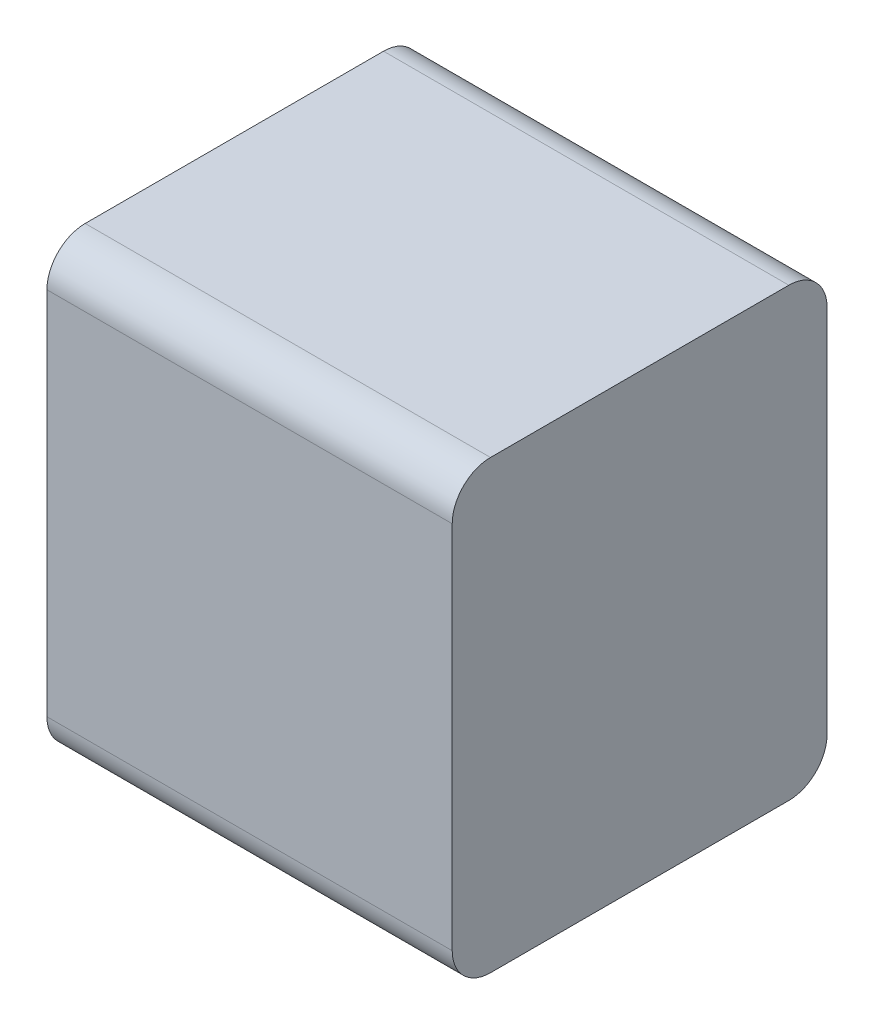
ISO-10303-21;
HEADER;
FILE_DESCRIPTION(('STEP AP214'),'2;1');
FILE_NAME('part.step','',(''),(''),'','','');
FILE_SCHEMA(('AUTOMOTIVE_DESIGN { 1 0 10303 214 1 1 1 1 }'));
ENDSEC;
DATA;
#1=APPLICATION_CONTEXT('core data for automotive mechanical design processes');
#2=APPLICATION_PROTOCOL_DEFINITION('international standard','automotive_design',2000,#1);
#3=PRODUCT_CONTEXT('',#1,'mechanical');
#4=PRODUCT('Part','Part','',(#3));
#5=PRODUCT_RELATED_PRODUCT_CATEGORY('part','',(#4));
#6=PRODUCT_DEFINITION_FORMATION('','',#4);
#7=PRODUCT_DEFINITION_CONTEXT('part definition',#1,'design');
#8=PRODUCT_DEFINITION('design','',#6,#7);
#9=PRODUCT_DEFINITION_SHAPE('','',#8);
#10=(LENGTH_UNIT() NAMED_UNIT(*) SI_UNIT(.MILLI.,.METRE.));
#11=(NAMED_UNIT(*) PLANE_ANGLE_UNIT() SI_UNIT($,.RADIAN.));
#12=(NAMED_UNIT(*) SI_UNIT($,.STERADIAN.) SOLID_ANGLE_UNIT());
#13=UNCERTAINTY_MEASURE_WITH_UNIT(LENGTH_MEASURE(1.E-05),#10,'distance_accuracy_value','');
#14=(GEOMETRIC_REPRESENTATION_CONTEXT(3) GLOBAL_UNCERTAINTY_ASSIGNED_CONTEXT((#13)) GLOBAL_UNIT_ASSIGNED_CONTEXT((#10,
#11,#12)) REPRESENTATION_CONTEXT('',''));
#15=CARTESIAN_POINT('',(0.,0.,0.));
#16=DIRECTION('',(0.,0.,1.));
#17=DIRECTION('',(1.,0.,0.));
#18=AXIS2_PLACEMENT_3D('',#15,#16,#17);
#19=CARTESIAN_POINT('',(-2.225,-2.45,0.042));
#20=DIRECTION('',(1.,0.,0.));
#21=DIRECTION('',(0.,0.,1.));
#22=AXIS2_PLACEMENT_3D('',#19,#20,#21);
#23=PLANE('',#22);
#24=CARTESIAN_POINT('',(-2.225,-2.03,3.738));
#25=DIRECTION('',(-1.,0.,0.));
#26=DIRECTION('',(0.,0.,1.));
#27=AXIS2_PLACEMENT_3D('',#24,#25,#26);
#28=CIRCLE('',#27,0.42);
#29=CARTESIAN_POINT('',(-2.225,-2.45,3.738));
#30=VERTEX_POINT('',#29);
#31=CARTESIAN_POINT('',(-2.225,-2.03,4.158));
#32=VERTEX_POINT('',#31);
#33=EDGE_CURVE('E11',#30,#32,#28,.T.);
#34=ORIENTED_EDGE('',*,*,#33,.T.);
#35=DIRECTION('',(0.,1.,0.));
#36=VECTOR('',#35,1.);
#37=CARTESIAN_POINT('',(-2.225,-2.45,4.158));
#38=LINE('',#37,#36);
#39=CARTESIAN_POINT('',(-2.225,2.03,4.158));
#40=VERTEX_POINT('',#39);
#41=EDGE_CURVE('E24',#32,#40,#38,.T.);
#42=ORIENTED_EDGE('',*,*,#41,.T.);
#43=CARTESIAN_POINT('',(-2.225,2.03,3.738));
#44=DIRECTION('',(1.,0.,0.));
#45=DIRECTION('',(0.,0.,1.));
#46=AXIS2_PLACEMENT_3D('',#43,#44,#45);
#47=CIRCLE('',#46,0.42);
#48=CARTESIAN_POINT('',(-2.225,2.45,3.738));
#49=VERTEX_POINT('',#48);
#50=EDGE_CURVE('E143',#49,#40,#47,.T.);
#51=ORIENTED_EDGE('',*,*,#50,.F.);
#52=DIRECTION('',(0.,0.,1.));
#53=VECTOR('',#52,1.);
#54=CARTESIAN_POINT('',(-2.225,2.45,0.042));
#55=LINE('',#54,#53);
#56=CARTESIAN_POINT('',(-2.225,2.45,0.462));
#57=VERTEX_POINT('',#56);
#58=EDGE_CURVE('E98',#57,#49,#55,.T.);
#59=ORIENTED_EDGE('',*,*,#58,.F.);
#60=CARTESIAN_POINT('',(-2.225,2.03,0.462));
#61=DIRECTION('',(-1.,0.,0.));
#62=DIRECTION('',(0.,0.,1.));
#63=AXIS2_PLACEMENT_3D('',#60,#61,#62);
#64=CIRCLE('',#63,0.42);
#65=CARTESIAN_POINT('',(-2.225,2.03,0.042));
#66=VERTEX_POINT('',#65);
#67=EDGE_CURVE('E139',#57,#66,#64,.T.);
#68=ORIENTED_EDGE('',*,*,#67,.T.);
#69=DIRECTION('',(0.,1.,0.));
#70=VECTOR('',#69,1.);
#71=CARTESIAN_POINT('',(-2.225,-2.45,0.042));
#72=LINE('',#71,#70);
#73=CARTESIAN_POINT('',(-2.225,-2.03,0.042));
#74=VERTEX_POINT('',#73);
#75=EDGE_CURVE('E137',#74,#66,#72,.T.);
#76=ORIENTED_EDGE('',*,*,#75,.F.);
#77=CARTESIAN_POINT('',(-2.225,-2.03,0.462));
#78=DIRECTION('',(1.,0.,0.));
#79=DIRECTION('',(0.,0.,1.));
#80=AXIS2_PLACEMENT_3D('',#77,#78,#79);
#81=CIRCLE('',#80,0.42);
#82=CARTESIAN_POINT('',(-2.225,-2.45,0.462));
#83=VERTEX_POINT('',#82);
#84=EDGE_CURVE('E135',#83,#74,#81,.T.);
#85=ORIENTED_EDGE('',*,*,#84,.F.);
#86=DIRECTION('',(0.,0.,1.));
#87=VECTOR('',#86,1.);
#88=CARTESIAN_POINT('',(-2.225,-2.45,0.042));
#89=LINE('',#88,#87);
#90=EDGE_CURVE('E36',#83,#30,#89,.T.);
#91=ORIENTED_EDGE('',*,*,#90,.T.);
#92=EDGE_LOOP('',(#34,#42,#51,#59,#68,#76,#85,#91));
#93=FACE_BOUND('',#92,.T.);
#94=ADVANCED_FACE('F17',(#93),#23,.F.);
#95=CARTESIAN_POINT('',(-2.225,-2.45,0.042));
#96=DIRECTION('',(0.,1.,0.));
#97=DIRECTION('',(0.,0.,1.));
#98=AXIS2_PLACEMENT_3D('',#95,#96,#97);
#99=PLANE('',#98);
#100=DIRECTION('',(1.,0.,0.));
#101=VECTOR('',#100,1.);
#102=CARTESIAN_POINT('',(-2.225,-2.45,3.738));
#103=LINE('',#102,#101);
#104=CARTESIAN_POINT('',(2.225,-2.45,3.738));
#105=VERTEX_POINT('',#104);
#106=EDGE_CURVE('E131',#30,#105,#103,.T.);
#107=ORIENTED_EDGE('',*,*,#106,.F.);
#108=ORIENTED_EDGE('',*,*,#90,.F.);
#109=DIRECTION('',(1.,0.,0.));
#110=VECTOR('',#109,1.);
#111=CARTESIAN_POINT('',(-2.225,-2.45,0.462));
#112=LINE('',#111,#110);
#113=CARTESIAN_POINT('',(2.225,-2.45,0.462));
#114=VERTEX_POINT('',#113);
#115=EDGE_CURVE('E128',#83,#114,#112,.T.);
#116=ORIENTED_EDGE('',*,*,#115,.T.);
#117=DIRECTION('',(0.,0.,1.));
#118=VECTOR('',#117,1.);
#119=CARTESIAN_POINT('',(2.225,-2.45,0.042));
#120=LINE('',#119,#118);
#121=EDGE_CURVE('E126',#114,#105,#120,.T.);
#122=ORIENTED_EDGE('',*,*,#121,.T.);
#123=EDGE_LOOP('',(#107,#108,#116,#122));
#124=FACE_BOUND('',#123,.T.);
#125=ADVANCED_FACE('F151',(#124),#99,.F.);
#126=CARTESIAN_POINT('',(-2.225,-2.03,0.462));
#127=DIRECTION('',(1.,0.,0.));
#128=DIRECTION('',(0.,-1.,0.));
#129=AXIS2_PLACEMENT_3D('',#126,#127,#128);
#130=CYLINDRICAL_SURFACE('',#129,0.42);
#131=ORIENTED_EDGE('',*,*,#84,.T.);
#132=DIRECTION('',(1.,0.,0.));
#133=VECTOR('',#132,1.);
#134=CARTESIAN_POINT('',(-2.225,-2.03,0.042));
#135=LINE('',#134,#133);
#136=CARTESIAN_POINT('',(2.225,-2.03,0.042));
#137=VERTEX_POINT('',#136);
#138=EDGE_CURVE('E124',#74,#137,#135,.T.);
#139=ORIENTED_EDGE('',*,*,#138,.T.);
#140=CARTESIAN_POINT('',(2.225,-2.03,0.462));
#141=DIRECTION('',(1.,0.,0.));
#142=DIRECTION('',(0.,0.,1.));
#143=AXIS2_PLACEMENT_3D('',#140,#141,#142);
#144=CIRCLE('',#143,0.42);
#145=EDGE_CURVE('E121',#114,#137,#144,.T.);
#146=ORIENTED_EDGE('',*,*,#145,.F.);
#147=ORIENTED_EDGE('',*,*,#115,.F.);
#148=EDGE_LOOP('',(#131,#139,#146,#147));
#149=FACE_BOUND('',#148,.T.);
#150=ADVANCED_FACE('F155',(#149),#130,.T.);
#151=CARTESIAN_POINT('',(-2.225,-2.03,3.738));
#152=DIRECTION('',(1.,0.,0.));
#153=DIRECTION('',(0.,-1.,0.));
#154=AXIS2_PLACEMENT_3D('',#151,#152,#153);
#155=CYLINDRICAL_SURFACE('',#154,0.42);
#156=ORIENTED_EDGE('',*,*,#106,.T.);
#157=CARTESIAN_POINT('',(2.225,-2.03,3.738));
#158=DIRECTION('',(-1.,0.,0.));
#159=DIRECTION('',(0.,0.,1.));
#160=AXIS2_PLACEMENT_3D('',#157,#158,#159);
#161=CIRCLE('',#160,0.42);
#162=CARTESIAN_POINT('',(2.225,-2.03,4.158));
#163=VERTEX_POINT('',#162);
#164=EDGE_CURVE('E119',#105,#163,#161,.T.);
#165=ORIENTED_EDGE('',*,*,#164,.T.);
#166=DIRECTION('',(1.,0.,0.));
#167=VECTOR('',#166,1.);
#168=CARTESIAN_POINT('',(-2.225,-2.03,4.158));
#169=LINE('',#168,#167);
#170=EDGE_CURVE('E117',#32,#163,#169,.T.);
#171=ORIENTED_EDGE('',*,*,#170,.F.);
#172=ORIENTED_EDGE('',*,*,#33,.F.);
#173=EDGE_LOOP('',(#156,#165,#171,#172));
#174=FACE_BOUND('',#173,.T.);
#175=ADVANCED_FACE('F148',(#174),#155,.T.);
#176=CARTESIAN_POINT('',(-2.225,-2.45,0.042));
#177=DIRECTION('',(0.,0.,1.));
#178=DIRECTION('',(1.,0.,0.));
#179=AXIS2_PLACEMENT_3D('',#176,#177,#178);
#180=PLANE('',#179);
#181=DIRECTION('',(1.,0.,0.));
#182=VECTOR('',#181,1.);
#183=CARTESIAN_POINT('',(-2.225,2.03,0.042));
#184=LINE('',#183,#182);
#185=CARTESIAN_POINT('',(2.225,2.03,0.042));
#186=VERTEX_POINT('',#185);
#187=EDGE_CURVE('E114',#66,#186,#184,.T.);
#188=ORIENTED_EDGE('',*,*,#187,.T.);
#189=DIRECTION('',(0.,1.,0.));
#190=VECTOR('',#189,1.);
#191=CARTESIAN_POINT('',(2.225,-2.45,0.042));
#192=LINE('',#191,#190);
#193=EDGE_CURVE('E112',#137,#186,#192,.T.);
#194=ORIENTED_EDGE('',*,*,#193,.F.);
#195=ORIENTED_EDGE('',*,*,#138,.F.);
#196=ORIENTED_EDGE('',*,*,#75,.T.);
#197=EDGE_LOOP('',(#188,#194,#195,#196));
#198=FACE_BOUND('',#197,.T.);
#199=ADVANCED_FACE('F159',(#198),#180,.F.);
#200=CARTESIAN_POINT('',(-2.225,-2.45,4.158));
#201=DIRECTION('',(0.,0.,1.));
#202=DIRECTION('',(1.,0.,0.));
#203=AXIS2_PLACEMENT_3D('',#200,#201,#202);
#204=PLANE('',#203);
#205=ORIENTED_EDGE('',*,*,#41,.F.);
#206=ORIENTED_EDGE('',*,*,#170,.T.);
#207=DIRECTION('',(0.,1.,0.));
#208=VECTOR('',#207,1.);
#209=CARTESIAN_POINT('',(2.225,-2.45,4.158));
#210=LINE('',#209,#208);
#211=CARTESIAN_POINT('',(2.225,2.03,4.158));
#212=VERTEX_POINT('',#211);
#213=EDGE_CURVE('E110',#163,#212,#210,.T.);
#214=ORIENTED_EDGE('',*,*,#213,.T.);
#215=DIRECTION('',(1.,0.,0.));
#216=VECTOR('',#215,1.);
#217=CARTESIAN_POINT('',(-2.225,2.03,4.158));
#218=LINE('',#217,#216);
#219=EDGE_CURVE('E86',#40,#212,#218,.T.);
#220=ORIENTED_EDGE('',*,*,#219,.F.);
#221=EDGE_LOOP('',(#205,#206,#214,#220));
#222=FACE_BOUND('',#221,.T.);
#223=ADVANCED_FACE('F145',(#222),#204,.T.);
#224=CARTESIAN_POINT('',(-2.225,2.03,0.462));
#225=DIRECTION('',(1.,0.,0.));
#226=DIRECTION('',(0.,1.,0.));
#227=AXIS2_PLACEMENT_3D('',#224,#225,#226);
#228=CYLINDRICAL_SURFACE('',#227,0.42);
#229=DIRECTION('',(1.,0.,0.));
#230=VECTOR('',#229,1.);
#231=CARTESIAN_POINT('',(-2.225,2.45,0.462));
#232=LINE('',#231,#230);
#233=CARTESIAN_POINT('',(2.225,2.45,0.462));
#234=VERTEX_POINT('',#233);
#235=EDGE_CURVE('E107',#57,#234,#232,.T.);
#236=ORIENTED_EDGE('',*,*,#235,.T.);
#237=CARTESIAN_POINT('',(2.225,2.03,0.462));
#238=DIRECTION('',(-1.,0.,0.));
#239=DIRECTION('',(0.,0.,1.));
#240=AXIS2_PLACEMENT_3D('',#237,#238,#239);
#241=CIRCLE('',#240,0.42);
#242=EDGE_CURVE('E90',#234,#186,#241,.T.);
#243=ORIENTED_EDGE('',*,*,#242,.T.);
#244=ORIENTED_EDGE('',*,*,#187,.F.);
#245=ORIENTED_EDGE('',*,*,#67,.F.);
#246=EDGE_LOOP('',(#236,#243,#244,#245));
#247=FACE_BOUND('',#246,.T.);
#248=ADVANCED_FACE('F163',(#247),#228,.T.);
#249=CARTESIAN_POINT('',(-2.225,2.03,3.738));
#250=DIRECTION('',(1.,0.,0.));
#251=DIRECTION('',(0.,1.,0.));
#252=AXIS2_PLACEMENT_3D('',#249,#250,#251);
#253=CYLINDRICAL_SURFACE('',#252,0.42);
#254=ORIENTED_EDGE('',*,*,#50,.T.);
#255=ORIENTED_EDGE('',*,*,#219,.T.);
#256=CARTESIAN_POINT('',(2.225,2.03,3.738));
#257=DIRECTION('',(1.,0.,0.));
#258=DIRECTION('',(0.,0.,1.));
#259=AXIS2_PLACEMENT_3D('',#256,#257,#258);
#260=CIRCLE('',#259,0.42);
#261=CARTESIAN_POINT('',(2.225,2.45,3.738));
#262=VERTEX_POINT('',#261);
#263=EDGE_CURVE('E82',#262,#212,#260,.T.);
#264=ORIENTED_EDGE('',*,*,#263,.F.);
#265=DIRECTION('',(1.,0.,0.));
#266=VECTOR('',#265,1.);
#267=CARTESIAN_POINT('',(-2.225,2.45,3.738));
#268=LINE('',#267,#266);
#269=EDGE_CURVE('E85',#49,#262,#268,.T.);
#270=ORIENTED_EDGE('',*,*,#269,.F.);
#271=EDGE_LOOP('',(#254,#255,#264,#270));
#272=FACE_BOUND('',#271,.T.);
#273=ADVANCED_FACE('F84',(#272),#253,.T.);
#274=CARTESIAN_POINT('',(-2.225,2.45,0.042));
#275=DIRECTION('',(0.,1.,0.));
#276=DIRECTION('',(0.,0.,1.));
#277=AXIS2_PLACEMENT_3D('',#274,#275,#276);
#278=PLANE('',#277);
#279=DIRECTION('',(0.,0.,1.));
#280=VECTOR('',#279,1.);
#281=CARTESIAN_POINT('',(2.225,2.45,0.042));
#282=LINE('',#281,#280);
#283=EDGE_CURVE('E96',#234,#262,#282,.T.);
#284=ORIENTED_EDGE('',*,*,#283,.F.);
#285=ORIENTED_EDGE('',*,*,#235,.F.);
#286=ORIENTED_EDGE('',*,*,#58,.T.);
#287=ORIENTED_EDGE('',*,*,#269,.T.);
#288=EDGE_LOOP('',(#284,#285,#286,#287));
#289=FACE_BOUND('',#288,.T.);
#290=ADVANCED_FACE('F94',(#289),#278,.T.);
#291=CARTESIAN_POINT('',(2.225,-2.45,0.042));
#292=DIRECTION('',(1.,0.,0.));
#293=DIRECTION('',(0.,0.,1.));
#294=AXIS2_PLACEMENT_3D('',#291,#292,#293);
#295=PLANE('',#294);
#296=ORIENTED_EDGE('',*,*,#121,.F.);
#297=ORIENTED_EDGE('',*,*,#145,.T.);
#298=ORIENTED_EDGE('',*,*,#193,.T.);
#299=ORIENTED_EDGE('',*,*,#242,.F.);
#300=ORIENTED_EDGE('',*,*,#283,.T.);
#301=ORIENTED_EDGE('',*,*,#263,.T.);
#302=ORIENTED_EDGE('',*,*,#213,.F.);
#303=ORIENTED_EDGE('',*,*,#164,.F.);
#304=EDGE_LOOP('',(#296,#297,#298,#299,#300,#301,#302,#303));
#305=FACE_BOUND('',#304,.T.);
#306=ADVANCED_FACE('F102',(#305),#295,.T.);
#307=CLOSED_SHELL('',(#94,#125,#150,#175,#199,#223,#248,#273,#290,#306));
#308=MANIFOLD_SOLID_BREP('B1',#307);
#309=ADVANCED_BREP_SHAPE_REPRESENTATION('',(#18,#308),#14);
#310=SHAPE_DEFINITION_REPRESENTATION(#9,#309);
ENDSEC;
END-ISO-10303-21;
